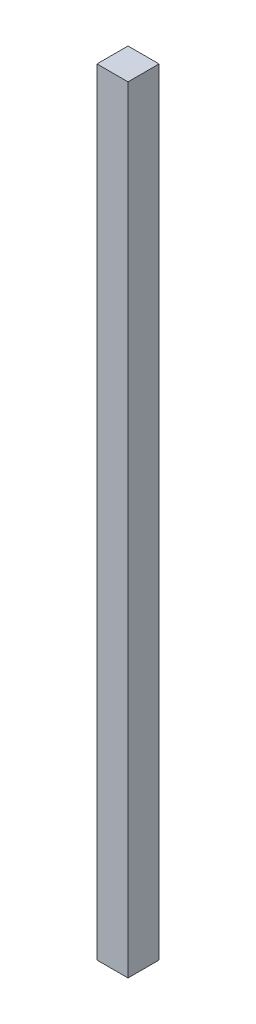
ISO-10303-21;
HEADER;
FILE_DESCRIPTION(('STEP AP214'),'2;1');
FILE_NAME('part.step','',(''),(''),'','','');
FILE_SCHEMA(('AUTOMOTIVE_DESIGN { 1 0 10303 214 1 1 1 1 }'));
ENDSEC;
DATA;
#1=APPLICATION_CONTEXT('core data for automotive mechanical design processes');
#2=APPLICATION_PROTOCOL_DEFINITION('international standard','automotive_design',2000,#1);
#3=PRODUCT_CONTEXT('',#1,'mechanical');
#4=PRODUCT('Part','Part','',(#3));
#5=PRODUCT_RELATED_PRODUCT_CATEGORY('part','',(#4));
#6=PRODUCT_DEFINITION_FORMATION('','',#4);
#7=PRODUCT_DEFINITION_CONTEXT('part definition',#1,'design');
#8=PRODUCT_DEFINITION('design','',#6,#7);
#9=PRODUCT_DEFINITION_SHAPE('','',#8);
#10=(LENGTH_UNIT() NAMED_UNIT(*) SI_UNIT(.MILLI.,.METRE.));
#11=(NAMED_UNIT(*) PLANE_ANGLE_UNIT() SI_UNIT($,.RADIAN.));
#12=(NAMED_UNIT(*) SI_UNIT($,.STERADIAN.) SOLID_ANGLE_UNIT());
#13=UNCERTAINTY_MEASURE_WITH_UNIT(LENGTH_MEASURE(1.E-05),#10,'distance_accuracy_value','');
#14=(GEOMETRIC_REPRESENTATION_CONTEXT(3) GLOBAL_UNCERTAINTY_ASSIGNED_CONTEXT((#13)) GLOBAL_UNIT_ASSIGNED_CONTEXT((#10,
#11,#12)) REPRESENTATION_CONTEXT('',''));
#15=CARTESIAN_POINT('',(0.,0.,0.));
#16=DIRECTION('',(0.,0.,1.));
#17=DIRECTION('',(1.,0.,0.));
#18=AXIS2_PLACEMENT_3D('',#15,#16,#17);
#19=CARTESIAN_POINT('',(-16.0788177339902,1000.,-23.2728428412522));
#20=DIRECTION('',(1.,0.,0.));
#21=DIRECTION('',(0.,0.,-1.));
#22=AXIS2_PLACEMENT_3D('',#19,#20,#21);
#23=PLANE('',#22);
#24=DIRECTION('',(0.,0.,1.));
#25=VECTOR('',#24,1.);
#26=CARTESIAN_POINT('',(-16.0788177339902,0.,-23.2728428412522));
#27=LINE('',#26,#25);
#28=CARTESIAN_POINT('',(-16.0788177339902,0.,-23.2728428412522));
#29=VERTEX_POINT('',#28);
#30=CARTESIAN_POINT('',(-16.0788177339902,0.,16.7271571587478));
#31=VERTEX_POINT('',#30);
#32=EDGE_CURVE('E98',#29,#31,#27,.T.);
#33=ORIENTED_EDGE('',*,*,#32,.T.);
#34=DIRECTION('',(0.,-1.,0.));
#35=VECTOR('',#34,1.);
#36=CARTESIAN_POINT('',(-16.0788177339902,1000.,16.7271571587478));
#37=LINE('',#36,#35);
#38=CARTESIAN_POINT('',(-16.0788177339902,1000.,16.7271571587478));
#39=VERTEX_POINT('',#38);
#40=EDGE_CURVE('E11',#39,#31,#37,.T.);
#41=ORIENTED_EDGE('',*,*,#40,.F.);
#42=DIRECTION('',(0.,0.,1.));
#43=VECTOR('',#42,1.);
#44=CARTESIAN_POINT('',(-16.0788177339902,1000.,-23.2728428412522));
#45=LINE('',#44,#43);
#46=CARTESIAN_POINT('',(-16.0788177339902,1000.,-23.2728428412522));
#47=VERTEX_POINT('',#46);
#48=EDGE_CURVE('E86',#47,#39,#45,.T.);
#49=ORIENTED_EDGE('',*,*,#48,.F.);
#50=DIRECTION('',(0.,-1.,0.));
#51=VECTOR('',#50,1.);
#52=CARTESIAN_POINT('',(-16.0788177339902,1000.,-23.2728428412522));
#53=LINE('',#52,#51);
#54=EDGE_CURVE('E94',#47,#29,#53,.T.);
#55=ORIENTED_EDGE('',*,*,#54,.T.);
#56=EDGE_LOOP('',(#33,#41,#49,#55));
#57=FACE_BOUND('',#56,.T.);
#58=ADVANCED_FACE('F35',(#57),#23,.F.);
#59=CARTESIAN_POINT('',(-16.0788177339902,1000.,16.7271571587478));
#60=DIRECTION('',(0.,0.,-1.));
#61=DIRECTION('',(-1.,0.,0.));
#62=AXIS2_PLACEMENT_3D('',#59,#60,#61);
#63=PLANE('',#62);
#64=DIRECTION('',(1.,0.,0.));
#65=VECTOR('',#64,1.);
#66=CARTESIAN_POINT('',(-16.0788177339902,0.,16.7271571587478));
#67=LINE('',#66,#65);
#68=CARTESIAN_POINT('',(23.9211822660098,0.,16.7271571587478));
#69=VERTEX_POINT('',#68);
#70=EDGE_CURVE('E90',#31,#69,#67,.T.);
#71=ORIENTED_EDGE('',*,*,#70,.T.);
#72=DIRECTION('',(0.,-1.,0.));
#73=VECTOR('',#72,1.);
#74=CARTESIAN_POINT('',(23.9211822660098,1000.,16.7271571587478));
#75=LINE('',#74,#73);
#76=CARTESIAN_POINT('',(23.9211822660098,1000.,16.7271571587478));
#77=VERTEX_POINT('',#76);
#78=EDGE_CURVE('E43',#77,#69,#75,.T.);
#79=ORIENTED_EDGE('',*,*,#78,.F.);
#80=DIRECTION('',(1.,0.,0.));
#81=VECTOR('',#80,1.);
#82=CARTESIAN_POINT('',(-16.0788177339902,1000.,16.7271571587478));
#83=LINE('',#82,#81);
#84=EDGE_CURVE('E81',#39,#77,#83,.T.);
#85=ORIENTED_EDGE('',*,*,#84,.F.);
#86=ORIENTED_EDGE('',*,*,#40,.T.);
#87=EDGE_LOOP('',(#71,#79,#85,#86));
#88=FACE_BOUND('',#87,.T.);
#89=ADVANCED_FACE('F89',(#88),#63,.F.);
#90=CARTESIAN_POINT('',(23.9211822660098,1000.,-23.2728428412522));
#91=DIRECTION('',(-1.,0.,0.));
#92=DIRECTION('',(0.,0.,1.));
#93=AXIS2_PLACEMENT_3D('',#90,#91,#92);
#94=PLANE('',#93);
#95=DIRECTION('',(0.,0.,-1.));
#96=VECTOR('',#95,1.);
#97=CARTESIAN_POINT('',(23.9211822660098,0.,-23.2728428412522));
#98=LINE('',#97,#96);
#99=CARTESIAN_POINT('',(23.9211822660098,0.,-23.2728428412522));
#100=VERTEX_POINT('',#99);
#101=EDGE_CURVE('E68',#69,#100,#98,.T.);
#102=ORIENTED_EDGE('',*,*,#101,.T.);
#103=DIRECTION('',(0.,-1.,0.));
#104=VECTOR('',#103,1.);
#105=CARTESIAN_POINT('',(23.9211822660098,1000.,-23.2728428412522));
#106=LINE('',#105,#104);
#107=CARTESIAN_POINT('',(23.9211822660098,1000.,-23.2728428412522));
#108=VERTEX_POINT('',#107);
#109=EDGE_CURVE('E91',#108,#100,#106,.T.);
#110=ORIENTED_EDGE('',*,*,#109,.F.);
#111=DIRECTION('',(0.,0.,-1.));
#112=VECTOR('',#111,1.);
#113=CARTESIAN_POINT('',(23.9211822660098,1000.,-23.2728428412522));
#114=LINE('',#113,#112);
#115=EDGE_CURVE('E84',#77,#108,#114,.T.);
#116=ORIENTED_EDGE('',*,*,#115,.F.);
#117=ORIENTED_EDGE('',*,*,#78,.T.);
#118=EDGE_LOOP('',(#102,#110,#116,#117));
#119=FACE_BOUND('',#118,.T.);
#120=ADVANCED_FACE('F92',(#119),#94,.F.);
#121=CARTESIAN_POINT('',(-16.0788177339902,1000.,-23.2728428412522));
#122=DIRECTION('',(0.,0.,1.));
#123=DIRECTION('',(1.,0.,0.));
#124=AXIS2_PLACEMENT_3D('',#121,#122,#123);
#125=PLANE('',#124);
#126=DIRECTION('',(-1.,0.,0.));
#127=VECTOR('',#126,1.);
#128=CARTESIAN_POINT('',(-16.0788177339902,0.,-23.2728428412522));
#129=LINE('',#128,#127);
#130=EDGE_CURVE('E74',#100,#29,#129,.T.);
#131=ORIENTED_EDGE('',*,*,#130,.T.);
#132=ORIENTED_EDGE('',*,*,#54,.F.);
#133=DIRECTION('',(-1.,0.,0.));
#134=VECTOR('',#133,1.);
#135=CARTESIAN_POINT('',(-16.0788177339902,1000.,-23.2728428412522));
#136=LINE('',#135,#134);
#137=EDGE_CURVE('E51',#108,#47,#136,.T.);
#138=ORIENTED_EDGE('',*,*,#137,.F.);
#139=ORIENTED_EDGE('',*,*,#109,.T.);
#140=EDGE_LOOP('',(#131,#132,#138,#139));
#141=FACE_BOUND('',#140,.T.);
#142=ADVANCED_FACE('F105',(#141),#125,.F.);
#143=CARTESIAN_POINT('',(0.,1000.,0.));
#144=DIRECTION('',(0.,1.,0.));
#145=DIRECTION('',(0.,0.,1.));
#146=AXIS2_PLACEMENT_3D('',#143,#144,#145);
#147=PLANE('',#146);
#148=ORIENTED_EDGE('',*,*,#48,.T.);
#149=ORIENTED_EDGE('',*,*,#84,.T.);
#150=ORIENTED_EDGE('',*,*,#115,.T.);
#151=ORIENTED_EDGE('',*,*,#137,.T.);
#152=EDGE_LOOP('',(#148,#149,#150,#151));
#153=FACE_BOUND('',#152,.T.);
#154=ADVANCED_FACE('F82',(#153),#147,.T.);
#155=CARTESIAN_POINT('',(0.,0.,0.));
#156=DIRECTION('',(0.,1.,0.));
#157=DIRECTION('',(0.,0.,1.));
#158=AXIS2_PLACEMENT_3D('',#155,#156,#157);
#159=PLANE('',#158);
#160=ORIENTED_EDGE('',*,*,#32,.F.);
#161=ORIENTED_EDGE('',*,*,#130,.F.);
#162=ORIENTED_EDGE('',*,*,#101,.F.);
#163=ORIENTED_EDGE('',*,*,#70,.F.);
#164=EDGE_LOOP('',(#160,#161,#162,#163));
#165=FACE_BOUND('',#164,.T.);
#166=ADVANCED_FACE('F108',(#165),#159,.F.);
#167=CLOSED_SHELL('',(#58,#89,#120,#142,#154,#166));
#168=MANIFOLD_SOLID_BREP('B2',#167);
#169=ADVANCED_BREP_SHAPE_REPRESENTATION('',(#18,#168),#14);
#170=SHAPE_DEFINITION_REPRESENTATION(#9,#169);
ENDSEC;
END-ISO-10303-21;
